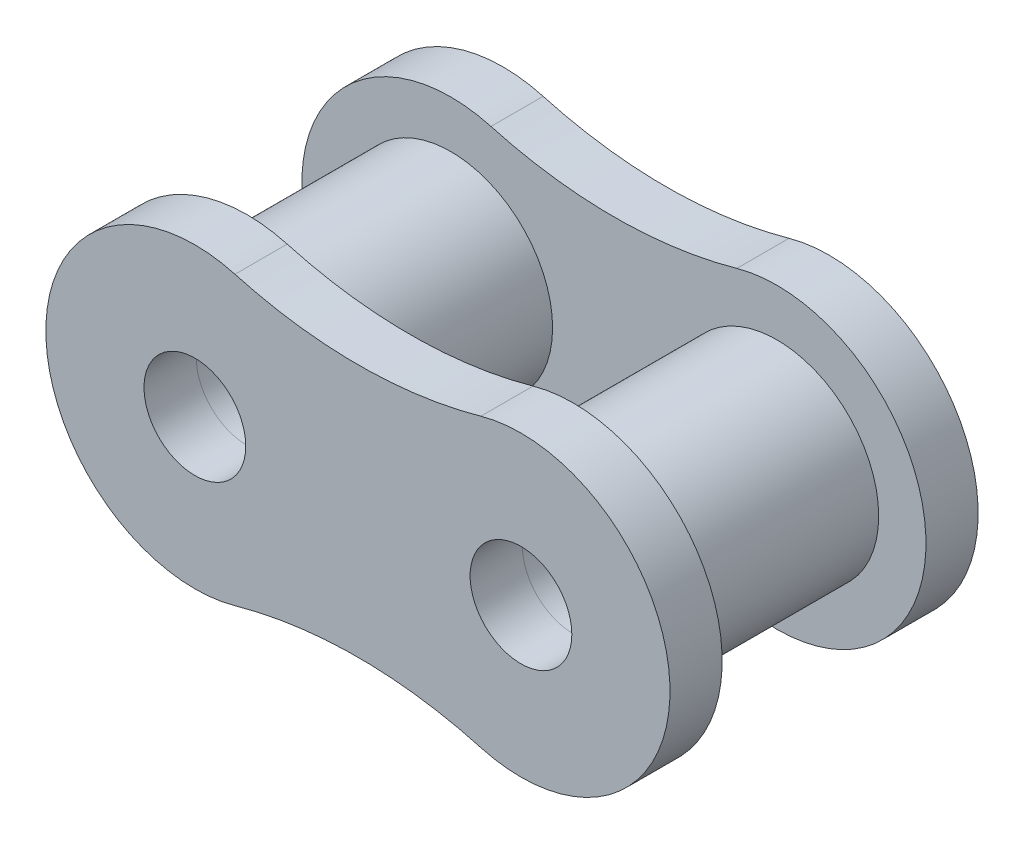
ISO-10303-21;
HEADER;
FILE_DESCRIPTION(('STEP AP214'),'2;1');
FILE_NAME('part.step','',(''),(''),'','','');
FILE_SCHEMA(('AUTOMOTIVE_DESIGN { 1 0 10303 214 1 1 1 1 }'));
ENDSEC;
DATA;
#1=APPLICATION_CONTEXT('core data for automotive mechanical design processes');
#2=APPLICATION_PROTOCOL_DEFINITION('international standard','automotive_design',2000,#1);
#3=PRODUCT_CONTEXT('',#1,'mechanical');
#4=PRODUCT('Part','Part','',(#3));
#5=PRODUCT_RELATED_PRODUCT_CATEGORY('part','',(#4));
#6=PRODUCT_DEFINITION_FORMATION('','',#4);
#7=PRODUCT_DEFINITION_CONTEXT('part definition',#1,'design');
#8=PRODUCT_DEFINITION('design','',#6,#7);
#9=PRODUCT_DEFINITION_SHAPE('','',#8);
#10=(LENGTH_UNIT() NAMED_UNIT(*) SI_UNIT(.MILLI.,.METRE.));
#11=(NAMED_UNIT(*) PLANE_ANGLE_UNIT() SI_UNIT($,.RADIAN.));
#12=(NAMED_UNIT(*) SI_UNIT($,.STERADIAN.) SOLID_ANGLE_UNIT());
#13=UNCERTAINTY_MEASURE_WITH_UNIT(LENGTH_MEASURE(1.E-05),#10,'distance_accuracy_value','');
#14=(GEOMETRIC_REPRESENTATION_CONTEXT(3) GLOBAL_UNCERTAINTY_ASSIGNED_CONTEXT((#13)) GLOBAL_UNIT_ASSIGNED_CONTEXT((#10,
#11,#12)) REPRESENTATION_CONTEXT('',''));
#15=CARTESIAN_POINT('',(0.,0.,0.));
#16=DIRECTION('',(0.,0.,1.));
#17=DIRECTION('',(1.,0.,0.));
#18=AXIS2_PLACEMENT_3D('',#15,#16,#17);
#19=CARTESIAN_POINT('',(3.175,11.3614930643691,-3.96875));
#20=DIRECTION('',(0.,0.,-1.));
#21=DIRECTION('',(1.,0.,0.));
#22=AXIS2_PLACEMENT_3D('',#19,#20,#21);
#23=PLANE('',#22);
#24=CARTESIAN_POINT('',(0.,22.7229861287381,-3.96875));
#25=DIRECTION('',(0.,0.,-1.));
#26=DIRECTION('',(1.,0.,0.));
#27=AXIS2_PLACEMENT_3D('',#24,#25,#26);
#28=CIRCLE('',#27,17.7896711287381);
#29=CARTESIAN_POINT('',(4.78793189259472,5.58974046247474,-3.96875));
#30=VERTEX_POINT('',#29);
#31=CARTESIAN_POINT('',(-4.78793189259472,5.58974046247474,-3.96875));
#32=VERTEX_POINT('',#31);
#33=EDGE_CURVE('E155',#30,#32,#28,.T.);
#34=ORIENTED_EDGE('',*,*,#33,.T.);
#35=CARTESIAN_POINT('',(-6.35,0.,-3.96875));
#36=DIRECTION('',(0.,0.,1.));
#37=DIRECTION('',(1.,0.,0.));
#38=AXIS2_PLACEMENT_3D('',#35,#36,#37);
#39=CIRCLE('',#38,5.8039);
#40=CARTESIAN_POINT('',(-4.78793189259472,-5.58974046247474,-3.96875));
#41=VERTEX_POINT('',#40);
#42=EDGE_CURVE('E169',#32,#41,#39,.T.);
#43=ORIENTED_EDGE('',*,*,#42,.T.);
#44=CARTESIAN_POINT('',(0.,-22.7229861287381,-3.96875));
#45=DIRECTION('',(0.,0.,-1.));
#46=DIRECTION('',(1.,0.,0.));
#47=AXIS2_PLACEMENT_3D('',#44,#45,#46);
#48=CIRCLE('',#47,17.7896711287381);
#49=CARTESIAN_POINT('',(4.78793189259471,-5.58974046247473,-3.96875));
#50=VERTEX_POINT('',#49);
#51=EDGE_CURVE('E172',#41,#50,#48,.T.);
#52=ORIENTED_EDGE('',*,*,#51,.T.);
#53=CARTESIAN_POINT('',(6.35,0.,-3.96875));
#54=DIRECTION('',(0.,0.,1.));
#55=DIRECTION('',(1.,0.,0.));
#56=AXIS2_PLACEMENT_3D('',#53,#54,#55);
#57=CIRCLE('',#56,5.8039);
#58=EDGE_CURVE('E161',#50,#30,#57,.T.);
#59=ORIENTED_EDGE('',*,*,#58,.T.);
#60=EDGE_LOOP('',(#34,#43,#52,#59));
#61=FACE_BOUND('',#60,.T.);
#62=CARTESIAN_POINT('',(-6.35,0.,-3.96875));
#63=DIRECTION('',(0.,0.,-1.));
#64=DIRECTION('',(-1.,0.,0.));
#65=AXIS2_PLACEMENT_3D('',#62,#63,#64);
#66=CIRCLE('',#65,3.9624);
#67=CARTESIAN_POINT('',(-10.3124,0.,-3.96875));
#68=VERTEX_POINT('',#67);
#69=EDGE_CURVE('E43',#68,#68,#66,.F.);
#70=ORIENTED_EDGE('',*,*,#69,.F.);
#71=EDGE_LOOP('',(#70));
#72=FACE_BOUND('',#71,.T.);
#73=CARTESIAN_POINT('',(6.35,0.,-3.96875));
#74=DIRECTION('',(0.,0.,-1.));
#75=DIRECTION('',(-1.,0.,0.));
#76=AXIS2_PLACEMENT_3D('',#73,#74,#75);
#77=CIRCLE('',#76,3.9624);
#78=CARTESIAN_POINT('',(2.3876,0.,-3.96875));
#79=VERTEX_POINT('',#78);
#80=EDGE_CURVE('E11',#79,#79,#77,.F.);
#81=ORIENTED_EDGE('',*,*,#80,.F.);
#82=EDGE_LOOP('',(#81));
#83=FACE_BOUND('',#82,.T.);
#84=ADVANCED_FACE('F34',(#61,#72,#83),#23,.F.);
#85=CARTESIAN_POINT('',(6.35,0.,-3.96875));
#86=DIRECTION('',(0.,0.,1.));
#87=DIRECTION('',(1.,0.,0.));
#88=AXIS2_PLACEMENT_3D('',#85,#86,#87);
#89=CIRCLE('',#88,2.0066);
#90=CARTESIAN_POINT('',(8.3566,0.,-3.96875));
#91=VERTEX_POINT('',#90);
#92=EDGE_CURVE('E273',#91,#91,#89,.T.);
#93=ORIENTED_EDGE('',*,*,#92,.T.);
#94=EDGE_LOOP('',(#93));
#95=FACE_BOUND('',#94,.T.);
#96=CARTESIAN_POINT('',(6.35,0.,-3.96875));
#97=DIRECTION('',(0.,0.,1.));
#98=DIRECTION('',(1.,0.,0.));
#99=AXIS2_PLACEMENT_3D('',#96,#97,#98);
#100=CIRCLE('',#99,1.9812);
#101=CARTESIAN_POINT('',(8.3312,0.,-3.96875));
#102=VERTEX_POINT('',#101);
#103=EDGE_CURVE('E145',#102,#102,#100,.T.);
#104=ORIENTED_EDGE('',*,*,#103,.F.);
#105=EDGE_LOOP('',(#104));
#106=FACE_BOUND('',#105,.T.);
#107=ADVANCED_FACE('F187',(#95,#106),#23,.F.);
#108=CARTESIAN_POINT('',(3.175,11.3614930643691,-6.00075));
#109=DIRECTION('',(0.,0.,-1.));
#110=DIRECTION('',(1.,0.,0.));
#111=AXIS2_PLACEMENT_3D('',#108,#109,#110);
#112=PLANE('',#111);
#113=CARTESIAN_POINT('',(-6.35,0.,-6.00075));
#114=DIRECTION('',(0.,0.,1.));
#115=DIRECTION('',(1.,0.,0.));
#116=AXIS2_PLACEMENT_3D('',#113,#114,#115);
#117=CIRCLE('',#116,1.9812);
#118=CARTESIAN_POINT('',(-4.3688,0.,-6.00075));
#119=VERTEX_POINT('',#118);
#120=EDGE_CURVE('E152',#119,#119,#117,.T.);
#121=ORIENTED_EDGE('',*,*,#120,.T.);
#122=EDGE_LOOP('',(#121));
#123=FACE_BOUND('',#122,.T.);
#124=CARTESIAN_POINT('',(0.,22.7229861287381,-6.00075));
#125=DIRECTION('',(0.,0.,-1.));
#126=DIRECTION('',(1.,0.,0.));
#127=AXIS2_PLACEMENT_3D('',#124,#125,#126);
#128=CIRCLE('',#127,17.7896711287381);
#129=CARTESIAN_POINT('',(4.78793189259472,5.58974046247474,-6.00075));
#130=VERTEX_POINT('',#129);
#131=CARTESIAN_POINT('',(-4.78793189259472,5.58974046247474,-6.00075));
#132=VERTEX_POINT('',#131);
#133=EDGE_CURVE('E158',#130,#132,#128,.T.);
#134=ORIENTED_EDGE('',*,*,#133,.F.);
#135=CARTESIAN_POINT('',(6.35,0.,-6.00075));
#136=DIRECTION('',(0.,0.,1.));
#137=DIRECTION('',(1.,0.,0.));
#138=AXIS2_PLACEMENT_3D('',#135,#136,#137);
#139=CIRCLE('',#138,5.8039);
#140=CARTESIAN_POINT('',(4.78793189259471,-5.58974046247473,-6.00075));
#141=VERTEX_POINT('',#140);
#142=EDGE_CURVE('E165',#141,#130,#139,.T.);
#143=ORIENTED_EDGE('',*,*,#142,.F.);
#144=CARTESIAN_POINT('',(0.,-22.7229861287381,-6.00075));
#145=DIRECTION('',(0.,0.,-1.));
#146=DIRECTION('',(1.,0.,0.));
#147=AXIS2_PLACEMENT_3D('',#144,#145,#146);
#148=CIRCLE('',#147,17.7896711287381);
#149=CARTESIAN_POINT('',(-4.78793189259472,-5.58974046247474,-6.00075));
#150=VERTEX_POINT('',#149);
#151=EDGE_CURVE('E163',#150,#141,#148,.T.);
#152=ORIENTED_EDGE('',*,*,#151,.F.);
#153=CARTESIAN_POINT('',(-6.35,0.,-6.00075));
#154=DIRECTION('',(0.,0.,1.));
#155=DIRECTION('',(1.,0.,0.));
#156=AXIS2_PLACEMENT_3D('',#153,#154,#155);
#157=CIRCLE('',#156,5.8039);
#158=EDGE_CURVE('E160',#132,#150,#157,.T.);
#159=ORIENTED_EDGE('',*,*,#158,.F.);
#160=EDGE_LOOP('',(#134,#143,#152,#159));
#161=FACE_BOUND('',#160,.T.);
#162=CARTESIAN_POINT('',(6.35,0.,-6.00075));
#163=DIRECTION('',(0.,0.,1.));
#164=DIRECTION('',(1.,0.,0.));
#165=AXIS2_PLACEMENT_3D('',#162,#163,#164);
#166=CIRCLE('',#165,1.9812);
#167=CARTESIAN_POINT('',(8.3312,0.,-6.00075));
#168=VERTEX_POINT('',#167);
#169=EDGE_CURVE('E146',#168,#168,#166,.T.);
#170=ORIENTED_EDGE('',*,*,#169,.T.);
#171=EDGE_LOOP('',(#170));
#172=FACE_BOUND('',#171,.T.);
#173=ADVANCED_FACE('F243',(#123,#161,#172),#112,.T.);
#174=CARTESIAN_POINT('',(-6.35,0.,-3.96875));
#175=DIRECTION('',(0.,0.,1.));
#176=DIRECTION('',(1.,0.,0.));
#177=AXIS2_PLACEMENT_3D('',#174,#175,#176);
#178=CIRCLE('',#177,2.0066);
#179=CARTESIAN_POINT('',(-4.3434,0.,-3.96875));
#180=VERTEX_POINT('',#179);
#181=EDGE_CURVE('E282',#180,#180,#178,.T.);
#182=ORIENTED_EDGE('',*,*,#181,.T.);
#183=EDGE_LOOP('',(#182));
#184=FACE_BOUND('',#183,.T.);
#185=CARTESIAN_POINT('',(-6.35,0.,-3.96875));
#186=DIRECTION('',(0.,0.,1.));
#187=DIRECTION('',(1.,0.,0.));
#188=AXIS2_PLACEMENT_3D('',#185,#186,#187);
#189=CIRCLE('',#188,1.9812);
#190=CARTESIAN_POINT('',(-4.3688,0.,-3.96875));
#191=VERTEX_POINT('',#190);
#192=EDGE_CURVE('E149',#191,#191,#189,.T.);
#193=ORIENTED_EDGE('',*,*,#192,.F.);
#194=EDGE_LOOP('',(#193));
#195=FACE_BOUND('',#194,.T.);
#196=ADVANCED_FACE('F190',(#184,#195),#23,.F.);
#197=CARTESIAN_POINT('',(0.,22.7229861287381,-6.00075));
#198=DIRECTION('',(0.,0.,1.));
#199=DIRECTION('',(-1.,0.,0.));
#200=AXIS2_PLACEMENT_3D('',#197,#198,#199);
#201=CYLINDRICAL_SURFACE('',#200,17.7896711287381);
#202=ORIENTED_EDGE('',*,*,#33,.F.);
#203=DIRECTION('',(0.,0.,1.));
#204=VECTOR('',#203,1.);
#205=CARTESIAN_POINT('',(4.78793189259472,5.58974046247474,-6.00075));
#206=LINE('',#205,#204);
#207=EDGE_CURVE('E51',#130,#30,#206,.T.);
#208=ORIENTED_EDGE('',*,*,#207,.F.);
#209=ORIENTED_EDGE('',*,*,#133,.T.);
#210=DIRECTION('',(0.,0.,1.));
#211=VECTOR('',#210,1.);
#212=CARTESIAN_POINT('',(-4.78793189259472,5.58974046247474,-6.00075));
#213=LINE('',#212,#211);
#214=EDGE_CURVE('E79',#132,#32,#213,.T.);
#215=ORIENTED_EDGE('',*,*,#214,.T.);
#216=EDGE_LOOP('',(#202,#208,#209,#215));
#217=FACE_BOUND('',#216,.T.);
#218=ADVANCED_FACE('F36',(#217),#201,.F.);
#219=CARTESIAN_POINT('',(-6.35,0.,-6.00075));
#220=DIRECTION('',(0.,0.,1.));
#221=DIRECTION('',(-1.,0.,0.));
#222=AXIS2_PLACEMENT_3D('',#219,#220,#221);
#223=CYLINDRICAL_SURFACE('',#222,5.8039);
#224=ORIENTED_EDGE('',*,*,#42,.F.);
#225=ORIENTED_EDGE('',*,*,#214,.F.);
#226=ORIENTED_EDGE('',*,*,#158,.T.);
#227=DIRECTION('',(0.,0.,1.));
#228=VECTOR('',#227,1.);
#229=CARTESIAN_POINT('',(-4.78793189259472,-5.58974046247474,-6.00075));
#230=LINE('',#229,#228);
#231=EDGE_CURVE('E178',#150,#41,#230,.T.);
#232=ORIENTED_EDGE('',*,*,#231,.T.);
#233=EDGE_LOOP('',(#224,#225,#226,#232));
#234=FACE_BOUND('',#233,.T.);
#235=ADVANCED_FACE('F253',(#234),#223,.T.);
#236=CARTESIAN_POINT('',(0.,-22.7229861287381,-6.00075));
#237=DIRECTION('',(0.,0.,1.));
#238=DIRECTION('',(-1.,0.,0.));
#239=AXIS2_PLACEMENT_3D('',#236,#237,#238);
#240=CYLINDRICAL_SURFACE('',#239,17.7896711287381);
#241=ORIENTED_EDGE('',*,*,#51,.F.);
#242=ORIENTED_EDGE('',*,*,#231,.F.);
#243=ORIENTED_EDGE('',*,*,#151,.T.);
#244=DIRECTION('',(0.,0.,1.));
#245=VECTOR('',#244,1.);
#246=CARTESIAN_POINT('',(4.78793189259471,-5.58974046247473,-6.00075));
#247=LINE('',#246,#245);
#248=EDGE_CURVE('E69',#141,#50,#247,.T.);
#249=ORIENTED_EDGE('',*,*,#248,.T.);
#250=EDGE_LOOP('',(#241,#242,#243,#249));
#251=FACE_BOUND('',#250,.T.);
#252=ADVANCED_FACE('F251',(#251),#240,.F.);
#253=CARTESIAN_POINT('',(6.35,0.,-6.00075));
#254=DIRECTION('',(0.,0.,1.));
#255=DIRECTION('',(-1.,0.,0.));
#256=AXIS2_PLACEMENT_3D('',#253,#254,#255);
#257=CYLINDRICAL_SURFACE('',#256,5.8039);
#258=ORIENTED_EDGE('',*,*,#58,.F.);
#259=ORIENTED_EDGE('',*,*,#248,.F.);
#260=ORIENTED_EDGE('',*,*,#142,.T.);
#261=ORIENTED_EDGE('',*,*,#207,.T.);
#262=EDGE_LOOP('',(#258,#259,#260,#261));
#263=FACE_BOUND('',#262,.T.);
#264=ADVANCED_FACE('F241',(#263),#257,.T.);
#265=CARTESIAN_POINT('',(-6.35,0.,-6.00075));
#266=DIRECTION('',(0.,0.,1.));
#267=DIRECTION('',(-1.,0.,0.));
#268=AXIS2_PLACEMENT_3D('',#265,#266,#267);
#269=CYLINDRICAL_SURFACE('',#268,1.9812);
#270=ORIENTED_EDGE('',*,*,#120,.F.);
#271=EDGE_LOOP('',(#270));
#272=FACE_BOUND('',#271,.T.);
#273=ORIENTED_EDGE('',*,*,#192,.T.);
#274=EDGE_LOOP('',(#273));
#275=FACE_BOUND('',#274,.T.);
#276=ADVANCED_FACE('F237',(#272,#275),#269,.F.);
#277=CARTESIAN_POINT('',(6.35,0.,-6.00075));
#278=DIRECTION('',(0.,0.,1.));
#279=DIRECTION('',(-1.,0.,0.));
#280=AXIS2_PLACEMENT_3D('',#277,#278,#279);
#281=CYLINDRICAL_SURFACE('',#280,1.9812);
#282=ORIENTED_EDGE('',*,*,#169,.F.);
#283=EDGE_LOOP('',(#282));
#284=FACE_BOUND('',#283,.T.);
#285=ORIENTED_EDGE('',*,*,#103,.T.);
#286=EDGE_LOOP('',(#285));
#287=FACE_BOUND('',#286,.T.);
#288=ADVANCED_FACE('F234',(#284,#287),#281,.F.);
#289=CARTESIAN_POINT('',(3.175,11.3614930643691,3.96875));
#290=DIRECTION('',(0.,0.,1.));
#291=DIRECTION('',(1.,0.,0.));
#292=AXIS2_PLACEMENT_3D('',#289,#290,#291);
#293=PLANE('',#292);
#294=CARTESIAN_POINT('',(0.,22.7229861287381,3.96875));
#295=DIRECTION('',(0.,0.,-1.));
#296=DIRECTION('',(1.,0.,0.));
#297=AXIS2_PLACEMENT_3D('',#294,#295,#296);
#298=CIRCLE('',#297,17.7896711287381);
#299=CARTESIAN_POINT('',(4.78793189259472,5.58974046247474,3.96875));
#300=VERTEX_POINT('',#299);
#301=CARTESIAN_POINT('',(-4.78793189259472,5.58974046247474,3.96875));
#302=VERTEX_POINT('',#301);
#303=EDGE_CURVE('E133',#300,#302,#298,.T.);
#304=ORIENTED_EDGE('',*,*,#303,.F.);
#305=CARTESIAN_POINT('',(6.35,0.,3.96875));
#306=DIRECTION('',(0.,0.,1.));
#307=DIRECTION('',(1.,0.,0.));
#308=AXIS2_PLACEMENT_3D('',#305,#306,#307);
#309=CIRCLE('',#308,5.8039);
#310=CARTESIAN_POINT('',(4.78793189259471,-5.58974046247473,3.96875));
#311=VERTEX_POINT('',#310);
#312=EDGE_CURVE('E129',#311,#300,#309,.T.);
#313=ORIENTED_EDGE('',*,*,#312,.F.);
#314=CARTESIAN_POINT('',(0.,-22.7229861287381,3.96875));
#315=DIRECTION('',(0.,0.,-1.));
#316=DIRECTION('',(1.,0.,0.));
#317=AXIS2_PLACEMENT_3D('',#314,#315,#316);
#318=CIRCLE('',#317,17.7896711287381);
#319=CARTESIAN_POINT('',(-4.78793189259472,-5.58974046247474,3.96875));
#320=VERTEX_POINT('',#319);
#321=EDGE_CURVE('E303',#320,#311,#318,.T.);
#322=ORIENTED_EDGE('',*,*,#321,.F.);
#323=CARTESIAN_POINT('',(-6.35,0.,3.96875));
#324=DIRECTION('',(0.,0.,1.));
#325=DIRECTION('',(1.,0.,0.));
#326=AXIS2_PLACEMENT_3D('',#323,#324,#325);
#327=CIRCLE('',#326,5.8039);
#328=EDGE_CURVE('E301',#302,#320,#327,.T.);
#329=ORIENTED_EDGE('',*,*,#328,.F.);
#330=EDGE_LOOP('',(#304,#313,#322,#329));
#331=FACE_BOUND('',#330,.T.);
#332=CARTESIAN_POINT('',(6.35,0.,3.96875));
#333=DIRECTION('',(0.,0.,1.));
#334=DIRECTION('',(1.,0.,0.));
#335=AXIS2_PLACEMENT_3D('',#332,#333,#334);
#336=CIRCLE('',#335,3.9624);
#337=CARTESIAN_POINT('',(10.3124,0.,3.96875));
#338=VERTEX_POINT('',#337);
#339=EDGE_CURVE('E134',#338,#338,#336,.F.);
#340=ORIENTED_EDGE('',*,*,#339,.F.);
#341=EDGE_LOOP('',(#340));
#342=FACE_BOUND('',#341,.T.);
#343=CARTESIAN_POINT('',(-6.35,0.,3.96875));
#344=DIRECTION('',(0.,0.,1.));
#345=DIRECTION('',(1.,0.,0.));
#346=AXIS2_PLACEMENT_3D('',#343,#344,#345);
#347=CIRCLE('',#346,3.9624);
#348=CARTESIAN_POINT('',(-2.3876,0.,3.96875));
#349=VERTEX_POINT('',#348);
#350=EDGE_CURVE('E137',#349,#349,#347,.F.);
#351=ORIENTED_EDGE('',*,*,#350,.F.);
#352=EDGE_LOOP('',(#351));
#353=FACE_BOUND('',#352,.T.);
#354=ADVANCED_FACE('F222',(#331,#342,#353),#293,.F.);
#355=CARTESIAN_POINT('',(-6.35,0.,3.96875));
#356=DIRECTION('',(0.,0.,1.));
#357=DIRECTION('',(1.,0.,0.));
#358=AXIS2_PLACEMENT_3D('',#355,#356,#357);
#359=CIRCLE('',#358,2.0066);
#360=CARTESIAN_POINT('',(-4.3434,0.,3.96875));
#361=VERTEX_POINT('',#360);
#362=EDGE_CURVE('E276',#361,#361,#359,.T.);
#363=ORIENTED_EDGE('',*,*,#362,.F.);
#364=EDGE_LOOP('',(#363));
#365=FACE_BOUND('',#364,.T.);
#366=CARTESIAN_POINT('',(-6.35,0.,3.96875));
#367=DIRECTION('',(0.,0.,1.));
#368=DIRECTION('',(1.,0.,0.));
#369=AXIS2_PLACEMENT_3D('',#366,#367,#368);
#370=CIRCLE('',#369,1.9812);
#371=CARTESIAN_POINT('',(-4.3688,0.,3.96875));
#372=VERTEX_POINT('',#371);
#373=EDGE_CURVE('E289',#372,#372,#370,.T.);
#374=ORIENTED_EDGE('',*,*,#373,.T.);
#375=EDGE_LOOP('',(#374));
#376=FACE_BOUND('',#375,.T.);
#377=ADVANCED_FACE('F217',(#365,#376),#293,.F.);
#378=CARTESIAN_POINT('',(3.175,11.3614930643691,6.00075));
#379=DIRECTION('',(0.,0.,1.));
#380=DIRECTION('',(1.,0.,0.));
#381=AXIS2_PLACEMENT_3D('',#378,#379,#380);
#382=PLANE('',#381);
#383=CARTESIAN_POINT('',(-6.35,0.,6.00075));
#384=DIRECTION('',(0.,0.,1.));
#385=DIRECTION('',(1.,0.,0.));
#386=AXIS2_PLACEMENT_3D('',#383,#384,#385);
#387=CIRCLE('',#386,1.9812);
#388=CARTESIAN_POINT('',(-4.3688,0.,6.00075));
#389=VERTEX_POINT('',#388);
#390=EDGE_CURVE('E292',#389,#389,#387,.T.);
#391=ORIENTED_EDGE('',*,*,#390,.F.);
#392=EDGE_LOOP('',(#391));
#393=FACE_BOUND('',#392,.T.);
#394=CARTESIAN_POINT('',(0.,22.7229861287381,6.00075));
#395=DIRECTION('',(0.,0.,-1.));
#396=DIRECTION('',(1.,0.,0.));
#397=AXIS2_PLACEMENT_3D('',#394,#395,#396);
#398=CIRCLE('',#397,17.7896711287381);
#399=CARTESIAN_POINT('',(4.78793189259472,5.58974046247474,6.00075));
#400=VERTEX_POINT('',#399);
#401=CARTESIAN_POINT('',(-4.78793189259472,5.58974046247474,6.00075));
#402=VERTEX_POINT('',#401);
#403=EDGE_CURVE('E119',#400,#402,#398,.T.);
#404=ORIENTED_EDGE('',*,*,#403,.T.);
#405=CARTESIAN_POINT('',(-6.35,0.,6.00075));
#406=DIRECTION('',(0.,0.,1.));
#407=DIRECTION('',(1.,0.,0.));
#408=AXIS2_PLACEMENT_3D('',#405,#406,#407);
#409=CIRCLE('',#408,5.8039);
#410=CARTESIAN_POINT('',(-4.78793189259472,-5.58974046247474,6.00075));
#411=VERTEX_POINT('',#410);
#412=EDGE_CURVE('E108',#402,#411,#409,.T.);
#413=ORIENTED_EDGE('',*,*,#412,.T.);
#414=CARTESIAN_POINT('',(0.,-22.7229861287381,6.00075));
#415=DIRECTION('',(0.,0.,-1.));
#416=DIRECTION('',(1.,0.,0.));
#417=AXIS2_PLACEMENT_3D('',#414,#415,#416);
#418=CIRCLE('',#417,17.7896711287381);
#419=CARTESIAN_POINT('',(4.78793189259471,-5.58974046247473,6.00075));
#420=VERTEX_POINT('',#419);
#421=EDGE_CURVE('E118',#411,#420,#418,.T.);
#422=ORIENTED_EDGE('',*,*,#421,.T.);
#423=CARTESIAN_POINT('',(6.35,0.,6.00075));
#424=DIRECTION('',(0.,0.,1.));
#425=DIRECTION('',(1.,0.,0.));
#426=AXIS2_PLACEMENT_3D('',#423,#424,#425);
#427=CIRCLE('',#426,5.8039);
#428=EDGE_CURVE('E125',#420,#400,#427,.T.);
#429=ORIENTED_EDGE('',*,*,#428,.T.);
#430=EDGE_LOOP('',(#404,#413,#422,#429));
#431=FACE_BOUND('',#430,.T.);
#432=CARTESIAN_POINT('',(6.35,0.,6.00075));
#433=DIRECTION('',(0.,0.,1.));
#434=DIRECTION('',(1.,0.,0.));
#435=AXIS2_PLACEMENT_3D('',#432,#433,#434);
#436=CIRCLE('',#435,1.9812);
#437=CARTESIAN_POINT('',(8.3312,0.,6.00075));
#438=VERTEX_POINT('',#437);
#439=EDGE_CURVE('E286',#438,#438,#436,.T.);
#440=ORIENTED_EDGE('',*,*,#439,.F.);
#441=EDGE_LOOP('',(#440));
#442=FACE_BOUND('',#441,.T.);
#443=ADVANCED_FACE('F122',(#393,#431,#442),#382,.T.);
#444=CARTESIAN_POINT('',(6.35,0.,3.96875));
#445=DIRECTION('',(0.,0.,1.));
#446=DIRECTION('',(1.,0.,0.));
#447=AXIS2_PLACEMENT_3D('',#444,#445,#446);
#448=CIRCLE('',#447,2.0066);
#449=CARTESIAN_POINT('',(8.3566,0.,3.96875));
#450=VERTEX_POINT('',#449);
#451=EDGE_CURVE('E275',#450,#450,#448,.T.);
#452=ORIENTED_EDGE('',*,*,#451,.F.);
#453=EDGE_LOOP('',(#452));
#454=FACE_BOUND('',#453,.T.);
#455=CARTESIAN_POINT('',(6.35,0.,3.96875));
#456=DIRECTION('',(0.,0.,1.));
#457=DIRECTION('',(1.,0.,0.));
#458=AXIS2_PLACEMENT_3D('',#455,#456,#457);
#459=CIRCLE('',#458,1.9812);
#460=CARTESIAN_POINT('',(8.3312,0.,3.96875));
#461=VERTEX_POINT('',#460);
#462=EDGE_CURVE('E279',#461,#461,#459,.T.);
#463=ORIENTED_EDGE('',*,*,#462,.T.);
#464=EDGE_LOOP('',(#463));
#465=FACE_BOUND('',#464,.T.);
#466=ADVANCED_FACE('F216',(#454,#465),#293,.F.);
#467=CARTESIAN_POINT('',(0.,22.7229861287381,6.00075));
#468=DIRECTION('',(0.,0.,-1.));
#469=DIRECTION('',(-1.,0.,0.));
#470=AXIS2_PLACEMENT_3D('',#467,#468,#469);
#471=CYLINDRICAL_SURFACE('',#470,17.7896711287381);
#472=ORIENTED_EDGE('',*,*,#303,.T.);
#473=DIRECTION('',(0.,0.,-1.));
#474=VECTOR('',#473,1.);
#475=CARTESIAN_POINT('',(-4.78793189259472,5.58974046247474,6.00075));
#476=LINE('',#475,#474);
#477=EDGE_CURVE('E112',#402,#302,#476,.T.);
#478=ORIENTED_EDGE('',*,*,#477,.F.);
#479=ORIENTED_EDGE('',*,*,#403,.F.);
#480=DIRECTION('',(0.,0.,-1.));
#481=VECTOR('',#480,1.);
#482=CARTESIAN_POINT('',(4.78793189259472,5.58974046247474,6.00075));
#483=LINE('',#482,#481);
#484=EDGE_CURVE('E299',#400,#300,#483,.T.);
#485=ORIENTED_EDGE('',*,*,#484,.T.);
#486=EDGE_LOOP('',(#472,#478,#479,#485));
#487=FACE_BOUND('',#486,.T.);
#488=ADVANCED_FACE('F131',(#487),#471,.F.);
#489=CARTESIAN_POINT('',(-6.35,0.,6.00075));
#490=DIRECTION('',(0.,0.,-1.));
#491=DIRECTION('',(-1.,0.,0.));
#492=AXIS2_PLACEMENT_3D('',#489,#490,#491);
#493=CYLINDRICAL_SURFACE('',#492,5.8039);
#494=ORIENTED_EDGE('',*,*,#328,.T.);
#495=DIRECTION('',(0.,0.,-1.));
#496=VECTOR('',#495,1.);
#497=CARTESIAN_POINT('',(-4.78793189259472,-5.58974046247474,6.00075));
#498=LINE('',#497,#496);
#499=EDGE_CURVE('E115',#411,#320,#498,.T.);
#500=ORIENTED_EDGE('',*,*,#499,.F.);
#501=ORIENTED_EDGE('',*,*,#412,.F.);
#502=ORIENTED_EDGE('',*,*,#477,.T.);
#503=EDGE_LOOP('',(#494,#500,#501,#502));
#504=FACE_BOUND('',#503,.T.);
#505=ADVANCED_FACE('F110',(#504),#493,.T.);
#506=CARTESIAN_POINT('',(0.,-22.7229861287381,6.00075));
#507=DIRECTION('',(0.,0.,-1.));
#508=DIRECTION('',(-1.,0.,0.));
#509=AXIS2_PLACEMENT_3D('',#506,#507,#508);
#510=CYLINDRICAL_SURFACE('',#509,17.7896711287381);
#511=ORIENTED_EDGE('',*,*,#321,.T.);
#512=DIRECTION('',(0.,0.,-1.));
#513=VECTOR('',#512,1.);
#514=CARTESIAN_POINT('',(4.78793189259471,-5.58974046247473,6.00075));
#515=LINE('',#514,#513);
#516=EDGE_CURVE('E139',#420,#311,#515,.T.);
#517=ORIENTED_EDGE('',*,*,#516,.F.);
#518=ORIENTED_EDGE('',*,*,#421,.F.);
#519=ORIENTED_EDGE('',*,*,#499,.T.);
#520=EDGE_LOOP('',(#511,#517,#518,#519));
#521=FACE_BOUND('',#520,.T.);
#522=ADVANCED_FACE('F225',(#521),#510,.F.);
#523=CARTESIAN_POINT('',(6.35,0.,6.00075));
#524=DIRECTION('',(0.,0.,-1.));
#525=DIRECTION('',(-1.,0.,0.));
#526=AXIS2_PLACEMENT_3D('',#523,#524,#525);
#527=CYLINDRICAL_SURFACE('',#526,5.8039);
#528=ORIENTED_EDGE('',*,*,#312,.T.);
#529=ORIENTED_EDGE('',*,*,#484,.F.);
#530=ORIENTED_EDGE('',*,*,#428,.F.);
#531=ORIENTED_EDGE('',*,*,#516,.T.);
#532=EDGE_LOOP('',(#528,#529,#530,#531));
#533=FACE_BOUND('',#532,.T.);
#534=ADVANCED_FACE('F212',(#533),#527,.T.);
#535=CARTESIAN_POINT('',(-6.35,0.,6.00075));
#536=DIRECTION('',(0.,0.,-1.));
#537=DIRECTION('',(-1.,0.,0.));
#538=AXIS2_PLACEMENT_3D('',#535,#536,#537);
#539=CYLINDRICAL_SURFACE('',#538,1.9812);
#540=ORIENTED_EDGE('',*,*,#390,.T.);
#541=EDGE_LOOP('',(#540));
#542=FACE_BOUND('',#541,.T.);
#543=ORIENTED_EDGE('',*,*,#373,.F.);
#544=EDGE_LOOP('',(#543));
#545=FACE_BOUND('',#544,.T.);
#546=ADVANCED_FACE('F205',(#542,#545),#539,.F.);
#547=CARTESIAN_POINT('',(6.35,0.,6.00075));
#548=DIRECTION('',(0.,0.,-1.));
#549=DIRECTION('',(-1.,0.,0.));
#550=AXIS2_PLACEMENT_3D('',#547,#548,#549);
#551=CYLINDRICAL_SURFACE('',#550,1.9812);
#552=ORIENTED_EDGE('',*,*,#439,.T.);
#553=EDGE_LOOP('',(#552));
#554=FACE_BOUND('',#553,.T.);
#555=ORIENTED_EDGE('',*,*,#462,.F.);
#556=EDGE_LOOP('',(#555));
#557=FACE_BOUND('',#556,.T.);
#558=ADVANCED_FACE('F196',(#554,#557),#551,.F.);
#559=CARTESIAN_POINT('',(6.35,0.,3.96875));
#560=DIRECTION('',(0.,0.,-1.));
#561=DIRECTION('',(-1.,0.,0.));
#562=AXIS2_PLACEMENT_3D('',#559,#560,#561);
#563=CYLINDRICAL_SURFACE('',#562,3.9624);
#564=ORIENTED_EDGE('',*,*,#339,.T.);
#565=EDGE_LOOP('',(#564));
#566=FACE_BOUND('',#565,.T.);
#567=ORIENTED_EDGE('',*,*,#80,.T.);
#568=EDGE_LOOP('',(#567));
#569=FACE_BOUND('',#568,.T.);
#570=ADVANCED_FACE('F193',(#566,#569),#563,.T.);
#571=CARTESIAN_POINT('',(6.35,0.,3.96875));
#572=DIRECTION('',(0.,0.,-1.));
#573=DIRECTION('',(-1.,0.,0.));
#574=AXIS2_PLACEMENT_3D('',#571,#572,#573);
#575=CYLINDRICAL_SURFACE('',#574,2.0066);
#576=ORIENTED_EDGE('',*,*,#451,.T.);
#577=EDGE_LOOP('',(#576));
#578=FACE_BOUND('',#577,.T.);
#579=ORIENTED_EDGE('',*,*,#92,.F.);
#580=EDGE_LOOP('',(#579));
#581=FACE_BOUND('',#580,.T.);
#582=ADVANCED_FACE('F195',(#578,#581),#575,.F.);
#583=CARTESIAN_POINT('',(-6.35,0.,3.96875));
#584=DIRECTION('',(0.,0.,-1.));
#585=DIRECTION('',(-1.,0.,0.));
#586=AXIS2_PLACEMENT_3D('',#583,#584,#585);
#587=CYLINDRICAL_SURFACE('',#586,3.9624);
#588=ORIENTED_EDGE('',*,*,#350,.T.);
#589=EDGE_LOOP('',(#588));
#590=FACE_BOUND('',#589,.T.);
#591=ORIENTED_EDGE('',*,*,#69,.T.);
#592=EDGE_LOOP('',(#591));
#593=FACE_BOUND('',#592,.T.);
#594=ADVANCED_FACE('F183',(#590,#593),#587,.T.);
#595=CARTESIAN_POINT('',(-6.35,0.,3.96875));
#596=DIRECTION('',(0.,0.,-1.));
#597=DIRECTION('',(-1.,0.,0.));
#598=AXIS2_PLACEMENT_3D('',#595,#596,#597);
#599=CYLINDRICAL_SURFACE('',#598,2.0066);
#600=ORIENTED_EDGE('',*,*,#362,.T.);
#601=EDGE_LOOP('',(#600));
#602=FACE_BOUND('',#601,.T.);
#603=ORIENTED_EDGE('',*,*,#181,.F.);
#604=EDGE_LOOP('',(#603));
#605=FACE_BOUND('',#604,.T.);
#606=ADVANCED_FACE('F318',(#602,#605),#599,.F.);
#607=CLOSED_SHELL('',(#84,#107,#173,#196,#218,#235,#252,#264,#276,#288,#354,#377,#443,#466,#488,
#505,#522,#534,#546,#558,#570,#582,#594,#606));
#608=MANIFOLD_SOLID_BREP('B2',#607);
#609=ADVANCED_BREP_SHAPE_REPRESENTATION('',(#18,#608),#14);
#610=SHAPE_DEFINITION_REPRESENTATION(#9,#609);
ENDSEC;
END-ISO-10303-21;
